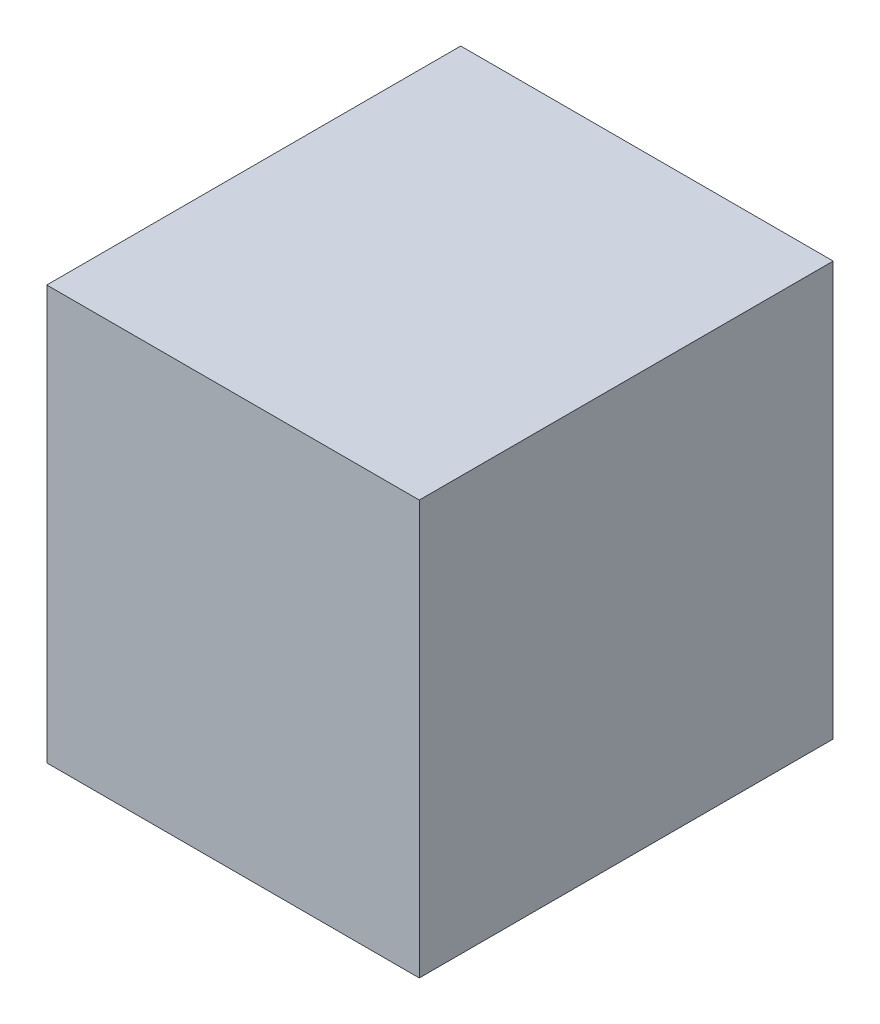
ISO-10303-21;
HEADER;
FILE_DESCRIPTION(('STEP AP214'),'2;1');
FILE_NAME('part.step','',(''),(''),'','','');
FILE_SCHEMA(('AUTOMOTIVE_DESIGN { 1 0 10303 214 1 1 1 1 }'));
ENDSEC;
DATA;
#1=APPLICATION_CONTEXT('core data for automotive mechanical design processes');
#2=APPLICATION_PROTOCOL_DEFINITION('international standard','automotive_design',2000,#1);
#3=PRODUCT_CONTEXT('',#1,'mechanical');
#4=PRODUCT('Part','Part','',(#3));
#5=PRODUCT_RELATED_PRODUCT_CATEGORY('part','',(#4));
#6=PRODUCT_DEFINITION_FORMATION('','',#4);
#7=PRODUCT_DEFINITION_CONTEXT('part definition',#1,'design');
#8=PRODUCT_DEFINITION('design','',#6,#7);
#9=PRODUCT_DEFINITION_SHAPE('','',#8);
#10=(LENGTH_UNIT() NAMED_UNIT(*) SI_UNIT(.MILLI.,.METRE.));
#11=(NAMED_UNIT(*) PLANE_ANGLE_UNIT() SI_UNIT($,.RADIAN.));
#12=(NAMED_UNIT(*) SI_UNIT($,.STERADIAN.) SOLID_ANGLE_UNIT());
#13=UNCERTAINTY_MEASURE_WITH_UNIT(LENGTH_MEASURE(1.E-05),#10,'distance_accuracy_value','');
#14=(GEOMETRIC_REPRESENTATION_CONTEXT(3) GLOBAL_UNCERTAINTY_ASSIGNED_CONTEXT((#13)) GLOBAL_UNIT_ASSIGNED_CONTEXT((#10,
#11,#12)) REPRESENTATION_CONTEXT('',''));
#15=CARTESIAN_POINT('',(0.,0.,0.));
#16=DIRECTION('',(0.,0.,1.));
#17=DIRECTION('',(1.,0.,0.));
#18=AXIS2_PLACEMENT_3D('',#15,#16,#17);
#19=CARTESIAN_POINT('',(-0.89993216,-1.00000054,0.));
#20=DIRECTION('',(-0.999999999998439,1.76692803236278E-06,0.));
#21=DIRECTION('',(-1.76692803236278E-06,-0.999999999998439,0.));
#22=AXIS2_PLACEMENT_3D('',#19,#20,#21);
#23=PLANE('',#22);
#24=DIRECTION('',(0.,1.,0.));
#25=VECTOR('',#24,1.);
#26=CARTESIAN_POINT('',(-0.89992962,-1.00000054,2.00000108));
#27=LINE('',#26,#25);
#28=CARTESIAN_POINT('',(-0.89992962,0.865676784224,2.00000108));
#29=VERTEX_POINT('',#28);
#30=CARTESIAN_POINT('',(-0.89993089,-1.00000054,2.00000108));
#31=VERTEX_POINT('',#30);
#32=EDGE_CURVE('E67',#29,#31,#27,.F.);
#33=ORIENTED_EDGE('',*,*,#32,.F.);
#34=DIRECTION('',(-1.66843295726135E-06,-0.999999999998608,0.));
#35=VECTOR('',#34,1.);
#36=CARTESIAN_POINT('',(-0.89992962,0.865676784224,2.00000108));
#37=LINE('',#36,#35);
#38=CARTESIAN_POINT('',(-0.89992939588991,1.00000054,2.00000108));
#39=VERTEX_POINT('',#38);
#40=EDGE_CURVE('E70',#29,#39,#37,.F.);
#41=ORIENTED_EDGE('',*,*,#40,.T.);
#42=DIRECTION('',(0.,0.,1.));
#43=VECTOR('',#42,1.);
#44=CARTESIAN_POINT('',(-0.89992939589,1.00000054,0.));
#45=LINE('',#44,#43);
#46=CARTESIAN_POINT('',(-0.89992939588991,1.00000054,0.));
#47=VERTEX_POINT('',#46);
#48=EDGE_CURVE('E86',#47,#39,#45,.T.);
#49=ORIENTED_EDGE('',*,*,#48,.F.);
#50=DIRECTION('',(-1.66843295726135E-06,-0.999999999998608,0.));
#51=VECTOR('',#50,1.);
#52=CARTESIAN_POINT('',(-0.89992962,0.865676784224,0.));
#53=LINE('',#52,#51);
#54=CARTESIAN_POINT('',(-0.89992962,0.865676784224,0.));
#55=VERTEX_POINT('',#54);
#56=EDGE_CURVE('E81',#47,#55,#53,.T.);
#57=ORIENTED_EDGE('',*,*,#56,.T.);
#58=DIRECTION('',(0.,1.,0.));
#59=VECTOR('',#58,1.);
#60=CARTESIAN_POINT('',(-0.89992962,0.43752262,0.));
#61=LINE('',#60,#59);
#62=CARTESIAN_POINT('',(-0.899929620000008,0.43752262,0.));
#63=VERTEX_POINT('',#62);
#64=EDGE_CURVE('E19',#55,#63,#61,.F.);
#65=ORIENTED_EDGE('',*,*,#64,.T.);
#66=DIRECTION('',(-1.76692803236278E-06,-0.999999999998439,0.));
#67=VECTOR('',#66,1.);
#68=CARTESIAN_POINT('',(-0.89993216,-1.00000054,0.));
#69=LINE('',#68,#67);
#70=CARTESIAN_POINT('',(-0.899931525,-1.00000054,0.));
#71=VERTEX_POINT('',#70);
#72=EDGE_CURVE('E82',#63,#71,#69,.T.);
#73=ORIENTED_EDGE('',*,*,#72,.T.);
#74=DIRECTION('',(0.,0.,-1.));
#75=VECTOR('',#74,1.);
#76=CARTESIAN_POINT('',(-0.89993216,-1.00000054,0.));
#77=LINE('',#76,#75);
#78=EDGE_CURVE('E72',#31,#71,#77,.T.);
#79=ORIENTED_EDGE('',*,*,#78,.F.);
#80=EDGE_LOOP('',(#33,#41,#49,#57,#65,#73,#79));
#81=FACE_BOUND('',#80,.T.);
#82=ADVANCED_FACE('F16',(#81),#23,.T.);
#83=CARTESIAN_POINT('',(-0.89992939589,1.00000054,0.));
#84=DIRECTION('',(0.,1.,0.));
#85=DIRECTION('',(0.,0.,1.));
#86=AXIS2_PLACEMENT_3D('',#83,#84,#85);
#87=PLANE('',#86);
#88=DIRECTION('',(0.,0.,-1.));
#89=VECTOR('',#88,1.);
#90=CARTESIAN_POINT('',(0.8999347,1.00000054,0.));
#91=LINE('',#90,#89);
#92=CARTESIAN_POINT('',(0.8999347,1.00000054,0.));
#93=VERTEX_POINT('',#92);
#94=CARTESIAN_POINT('',(0.8999347,1.00000054,2.00000108));
#95=VERTEX_POINT('',#94);
#96=EDGE_CURVE('E95',#93,#95,#91,.F.);
#97=ORIENTED_EDGE('',*,*,#96,.F.);
#98=DIRECTION('',(1.,0.,0.));
#99=VECTOR('',#98,1.);
#100=CARTESIAN_POINT('',(0.8999347,1.00000054,0.));
#101=LINE('',#100,#99);
#102=EDGE_CURVE('E91',#93,#47,#101,.F.);
#103=ORIENTED_EDGE('',*,*,#102,.T.);
#104=ORIENTED_EDGE('',*,*,#48,.T.);
#105=DIRECTION('',(1.,0.,0.));
#106=VECTOR('',#105,1.);
#107=CARTESIAN_POINT('',(0.8999347,1.00000054,2.00000108));
#108=LINE('',#107,#106);
#109=EDGE_CURVE('E76',#95,#39,#108,.F.);
#110=ORIENTED_EDGE('',*,*,#109,.F.);
#111=EDGE_LOOP('',(#97,#103,#104,#110));
#112=FACE_BOUND('',#111,.T.);
#113=ADVANCED_FACE('F107',(#112),#87,.T.);
#114=CARTESIAN_POINT('',(0.8999347,-1.00000054,2.00000108));
#115=DIRECTION('',(0.,0.,1.));
#116=DIRECTION('',(1.,0.,0.));
#117=AXIS2_PLACEMENT_3D('',#114,#115,#116);
#118=PLANE('',#117);
#119=ORIENTED_EDGE('',*,*,#32,.T.);
#120=DIRECTION('',(1.,0.,0.));
#121=VECTOR('',#120,1.);
#122=CARTESIAN_POINT('',(0.8999347,-1.00000054,2.00000108));
#123=LINE('',#122,#121);
#124=CARTESIAN_POINT('',(0.8999347,-1.00000054,2.00000108));
#125=VERTEX_POINT('',#124);
#126=EDGE_CURVE('E75',#125,#31,#123,.F.);
#127=ORIENTED_EDGE('',*,*,#126,.F.);
#128=DIRECTION('',(0.,1.,0.));
#129=VECTOR('',#128,1.);
#130=CARTESIAN_POINT('',(0.8999347,1.00000054,2.00000108));
#131=LINE('',#130,#129);
#132=EDGE_CURVE('E98',#95,#125,#131,.F.);
#133=ORIENTED_EDGE('',*,*,#132,.F.);
#134=ORIENTED_EDGE('',*,*,#109,.T.);
#135=ORIENTED_EDGE('',*,*,#40,.F.);
#136=EDGE_LOOP('',(#119,#127,#133,#134,#135));
#137=FACE_BOUND('',#136,.T.);
#138=ADVANCED_FACE('F79',(#137),#118,.T.);
#139=CARTESIAN_POINT('',(0.8999347,-1.00000054,0.));
#140=DIRECTION('',(0.,-1.,0.));
#141=DIRECTION('',(0.,0.,-1.));
#142=AXIS2_PLACEMENT_3D('',#139,#140,#141);
#143=PLANE('',#142);
#144=ORIENTED_EDGE('',*,*,#78,.T.);
#145=DIRECTION('',(1.,0.,0.));
#146=VECTOR('',#145,1.);
#147=CARTESIAN_POINT('',(0.8999347,-1.00000054,0.));
#148=LINE('',#147,#146);
#149=CARTESIAN_POINT('',(0.8999347,-1.00000054,0.));
#150=VERTEX_POINT('',#149);
#151=EDGE_CURVE('E34',#71,#150,#148,.T.);
#152=ORIENTED_EDGE('',*,*,#151,.T.);
#153=DIRECTION('',(0.,0.,-1.));
#154=VECTOR('',#153,1.);
#155=CARTESIAN_POINT('',(0.8999347,-1.00000054,0.));
#156=LINE('',#155,#154);
#157=EDGE_CURVE('E25',#125,#150,#156,.T.);
#158=ORIENTED_EDGE('',*,*,#157,.F.);
#159=ORIENTED_EDGE('',*,*,#126,.T.);
#160=EDGE_LOOP('',(#144,#152,#158,#159));
#161=FACE_BOUND('',#160,.T.);
#162=ADVANCED_FACE('F104',(#161),#143,.T.);
#163=CARTESIAN_POINT('',(0.8999347,-1.00000054,0.));
#164=DIRECTION('',(0.,0.,1.));
#165=DIRECTION('',(1.,0.,0.));
#166=AXIS2_PLACEMENT_3D('',#163,#164,#165);
#167=PLANE('',#166);
#168=ORIENTED_EDGE('',*,*,#72,.F.);
#169=ORIENTED_EDGE('',*,*,#64,.F.);
#170=ORIENTED_EDGE('',*,*,#56,.F.);
#171=ORIENTED_EDGE('',*,*,#102,.F.);
#172=DIRECTION('',(0.,1.,0.));
#173=VECTOR('',#172,1.);
#174=CARTESIAN_POINT('',(0.8999347,1.00000054,0.));
#175=LINE('',#174,#173);
#176=EDGE_CURVE('E11',#150,#93,#175,.T.);
#177=ORIENTED_EDGE('',*,*,#176,.F.);
#178=ORIENTED_EDGE('',*,*,#151,.F.);
#179=EDGE_LOOP('',(#168,#169,#170,#171,#177,#178));
#180=FACE_BOUND('',#179,.T.);
#181=ADVANCED_FACE('F108',(#180),#167,.F.);
#182=CARTESIAN_POINT('',(0.8999347,1.00000054,0.));
#183=DIRECTION('',(1.,0.,0.));
#184=DIRECTION('',(0.,0.,-1.));
#185=AXIS2_PLACEMENT_3D('',#182,#183,#184);
#186=PLANE('',#185);
#187=ORIENTED_EDGE('',*,*,#157,.T.);
#188=ORIENTED_EDGE('',*,*,#176,.T.);
#189=ORIENTED_EDGE('',*,*,#96,.T.);
#190=ORIENTED_EDGE('',*,*,#132,.T.);
#191=EDGE_LOOP('',(#187,#188,#189,#190));
#192=FACE_BOUND('',#191,.T.);
#193=ADVANCED_FACE('F103',(#192),#186,.T.);
#194=CLOSED_SHELL('',(#82,#113,#138,#162,#181,#193));
#195=MANIFOLD_SOLID_BREP('B1',#194);
#196=ADVANCED_BREP_SHAPE_REPRESENTATION('',(#18,#195),#14);
#197=SHAPE_DEFINITION_REPRESENTATION(#9,#196);
ENDSEC;
END-ISO-10303-21;
